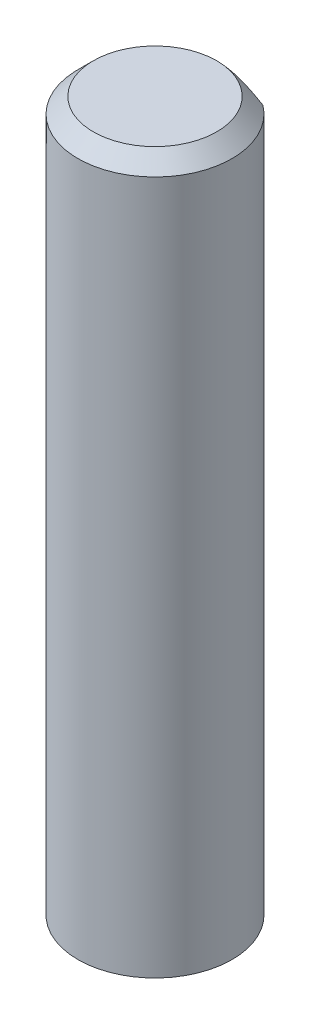
ISO-10303-21;
HEADER;
FILE_DESCRIPTION(('STEP AP214'),'2;1');
FILE_NAME('part.step','',(''),(''),'','','');
FILE_SCHEMA(('AUTOMOTIVE_DESIGN { 1 0 10303 214 1 1 1 1 }'));
ENDSEC;
DATA;
#1=APPLICATION_CONTEXT('core data for automotive mechanical design processes');
#2=APPLICATION_PROTOCOL_DEFINITION('international standard','automotive_design',2000,#1);
#3=PRODUCT_CONTEXT('',#1,'mechanical');
#4=PRODUCT('Part','Part','',(#3));
#5=PRODUCT_RELATED_PRODUCT_CATEGORY('part','',(#4));
#6=PRODUCT_DEFINITION_FORMATION('','',#4);
#7=PRODUCT_DEFINITION_CONTEXT('part definition',#1,'design');
#8=PRODUCT_DEFINITION('design','',#6,#7);
#9=PRODUCT_DEFINITION_SHAPE('','',#8);
#10=(LENGTH_UNIT() NAMED_UNIT(*) SI_UNIT(.MILLI.,.METRE.));
#11=(NAMED_UNIT(*) PLANE_ANGLE_UNIT() SI_UNIT($,.RADIAN.));
#12=(NAMED_UNIT(*) SI_UNIT($,.STERADIAN.) SOLID_ANGLE_UNIT());
#13=UNCERTAINTY_MEASURE_WITH_UNIT(LENGTH_MEASURE(1.E-05),#10,'distance_accuracy_value','');
#14=(GEOMETRIC_REPRESENTATION_CONTEXT(3) GLOBAL_UNCERTAINTY_ASSIGNED_CONTEXT((#13)) GLOBAL_UNIT_ASSIGNED_CONTEXT((#10,
#11,#12)) REPRESENTATION_CONTEXT('',''));
#15=CARTESIAN_POINT('',(0.,0.,0.));
#16=DIRECTION('',(0.,0.,1.));
#17=DIRECTION('',(1.,0.,0.));
#18=AXIS2_PLACEMENT_3D('',#15,#16,#17);
#19=CARTESIAN_POINT('',(0.,23.,0.));
#20=DIRECTION('',(0.,-1.,0.));
#21=DIRECTION('',(0.,0.,-1.));
#22=AXIS2_PLACEMENT_3D('',#19,#20,#21);
#23=CYLINDRICAL_SURFACE('',#22,2.5);
#24=CARTESIAN_POINT('',(0.,0.,0.));
#25=DIRECTION('',(0.,1.,0.));
#26=DIRECTION('',(0.,0.,1.));
#27=AXIS2_PLACEMENT_3D('',#24,#25,#26);
#28=CIRCLE('',#27,2.5);
#29=CARTESIAN_POINT('',(0.,0.,2.5));
#30=VERTEX_POINT('',#29);
#31=EDGE_CURVE('E86',#30,#30,#28,.T.);
#32=ORIENTED_EDGE('',*,*,#31,.T.);
#33=EDGE_LOOP('',(#32));
#34=FACE_BOUND('',#33,.T.);
#35=DIRECTION('',(0.,-1.,0.));
#36=VECTOR('',#35,1.);
#37=CARTESIAN_POINT('',(1.5,23.,-2.));
#38=LINE('',#37,#36);
#39=CARTESIAN_POINT('',(1.5,22.5,-2.));
#40=VERTEX_POINT('',#39);
#41=CARTESIAN_POINT('',(1.49999999999999,5.,-2.));
#42=VERTEX_POINT('',#41);
#43=EDGE_CURVE('E90',#40,#42,#38,.T.);
#44=ORIENTED_EDGE('',*,*,#43,.F.);
#45=CARTESIAN_POINT('',(0.,22.5,0.));
#46=DIRECTION('',(0.,1.,0.));
#47=DIRECTION('',(0.,0.,1.));
#48=AXIS2_PLACEMENT_3D('',#45,#46,#47);
#49=CIRCLE('',#48,2.5);
#50=CARTESIAN_POINT('',(-1.5,22.5,-2.));
#51=VERTEX_POINT('',#50);
#52=EDGE_CURVE('E81',#40,#51,#49,.F.);
#53=ORIENTED_EDGE('',*,*,#52,.T.);
#54=DIRECTION('',(0.,-1.,0.));
#55=VECTOR('',#54,1.);
#56=CARTESIAN_POINT('',(-1.5,23.,-2.));
#57=LINE('',#56,#55);
#58=CARTESIAN_POINT('',(-1.49999999999999,5.,-2.));
#59=VERTEX_POINT('',#58);
#60=EDGE_CURVE('E62',#59,#51,#57,.F.);
#61=ORIENTED_EDGE('',*,*,#60,.F.);
#62=CARTESIAN_POINT('',(0.,5.,0.));
#63=DIRECTION('',(0.,1.,0.));
#64=DIRECTION('',(0.,0.,1.));
#65=AXIS2_PLACEMENT_3D('',#62,#63,#64);
#66=CIRCLE('',#65,2.5);
#67=EDGE_CURVE('E12',#42,#59,#66,.T.);
#68=ORIENTED_EDGE('',*,*,#67,.F.);
#69=EDGE_LOOP('',(#44,#53,#61,#68));
#70=FACE_BOUND('',#69,.T.);
#71=ADVANCED_FACE('F45',(#34,#70),#23,.T.);
#72=CARTESIAN_POINT('',(0.,23.,0.));
#73=DIRECTION('',(0.,-1.,0.));
#74=DIRECTION('',(0.,0.,-1.));
#75=AXIS2_PLACEMENT_3D('',#72,#73,#74);
#76=CONICAL_SURFACE('',#75,1.99999999999999,0.785398163397452);
#77=ORIENTED_EDGE('',*,*,#52,.F.);
#78=CARTESIAN_POINT('',(7.25449509393499,17.4748621894396,-2.));
#79=CARTESIAN_POINT('',(7.10130735006501,17.6225333023172,-2.));
#80=CARTESIAN_POINT('',(6.94796117066203,17.7700405533027,-2.));
#81=CARTESIAN_POINT('',(6.64086781678304,18.0646400627591,-2.));
#82=CARTESIAN_POINT('',(6.48712063829408,18.211732317046,-2.));
#83=CARTESIAN_POINT('',(6.17908580623658,18.5054673118209,-2.));
#84=CARTESIAN_POINT('',(6.02479796972235,18.6521098605631,-2.));
#85=CARTESIAN_POINT('',(5.71562565052945,18.9447636471818,-2.));
#86=CARTESIAN_POINT('',(5.56074117050023,19.0907748878557,-2.));
#87=CARTESIAN_POINT('',(5.25286852088393,19.3795176670505,-2.));
#88=CARTESIAN_POINT('',(5.09989301195927,19.5222626949932,-2.));
#89=CARTESIAN_POINT('',(4.79302169158752,19.8067597803593,-2.));
#90=CARTESIAN_POINT('',(4.63912588464054,19.9485118426307,-2.));
#91=CARTESIAN_POINT('',(4.33016393943173,20.2306857487514,-2.));
#92=CARTESIAN_POINT('',(4.17509799539249,20.3711078049969,-2.));
#93=CARTESIAN_POINT('',(3.86338505676843,20.6501835027987,-2.));
#94=CARTESIAN_POINT('',(3.70673810325563,20.7888371900835,-2.));
#95=CARTESIAN_POINT('',(3.43709252348037,21.0237456599132,-2.));
#96=CARTESIAN_POINT('',(3.3246321098571,21.1206174520891,-2.));
#97=CARTESIAN_POINT('',(3.09830786962942,21.3127348108483,-2.));
#98=CARTESIAN_POINT('',(2.98444390619278,21.4079802166812,-2.));
#99=CARTESIAN_POINT('',(2.75379363964561,21.5972095932808,-2.));
#100=CARTESIAN_POINT('',(2.6369896345465,21.6911720611587,-2.));
#101=CARTESIAN_POINT('',(2.40099073907245,21.8760022572099,-2.));
#102=CARTESIAN_POINT('',(2.28179646718807,21.9668707699484,-2.));
#103=CARTESIAN_POINT('',(2.03847006982841,22.1454555557783,-2.));
#104=CARTESIAN_POINT('',(1.91429216532267,22.2331098475468,-2.));
#105=CARTESIAN_POINT('',(1.66118669776511,22.4018133650594,-2.));
#106=CARTESIAN_POINT('',(1.53225290587243,22.4828534473632,-2.));
#107=CARTESIAN_POINT('',(1.33495952912817,22.5959838475536,-2.));
#108=CARTESIAN_POINT('',(1.26893132591604,22.6321076401526,-2.));
#109=CARTESIAN_POINT('',(1.13516497109581,22.701021995293,-2.));
#110=CARTESIAN_POINT('',(1.06742649606793,22.7338119214026,-2.));
#111=CARTESIAN_POINT('',(0.861686658909709,22.8257190537923,-2.));
#112=CARTESIAN_POINT('',(0.720677816064533,22.8786648196837,-2.));
#113=CARTESIAN_POINT('',(0.509481676281375,22.9371187351225,-2.));
#114=CARTESIAN_POINT('',(0.442092975904698,22.952813264213,-2.));
#115=CARTESIAN_POINT('',(0.306116368603034,22.9778112037307,-2.));
#116=CARTESIAN_POINT('',(0.237528598088365,22.9871153363616,-2.));
#117=CARTESIAN_POINT('',(0.100031376223158,22.9986666035481,-2.));
#118=CARTESIAN_POINT('',(0.0311243530281637,23.000942169019,-2.));
#119=CARTESIAN_POINT('',(-0.106556947382143,22.9983466346817,-2.));
#120=CARTESIAN_POINT('',(-0.175331216465979,22.9934751101894,-2.));
#121=CARTESIAN_POINT('',(-0.311543049671943,22.9770030345677,-2.));
#122=CARTESIAN_POINT('',(-0.378986701737154,22.9654517625723,-2.));
#123=CARTESIAN_POINT('',(-0.512583330113459,22.9363904663663,-2.));
#124=CARTESIAN_POINT('',(-0.578735767199119,22.9188780067064,-2.));
#125=CARTESIAN_POINT('',(-0.70988486742688,22.8786771191567,-2.));
#126=CARTESIAN_POINT('',(-0.77487156611104,22.8559566346769,-2.));
#127=CARTESIAN_POINT('',(-0.903184817554153,22.8063166319853,-2.));
#128=CARTESIAN_POINT('',(-0.966511680534066,22.7793979050506,-2.));
#129=CARTESIAN_POINT('',(-1.14796812924228,22.6963924835464,-2.));
#130=CARTESIAN_POINT('',(-1.2640655721229,22.6358782904442,-2.));
#131=CARTESIAN_POINT('',(-1.49169480576319,22.5067340076282,-2.));
#132=CARTESIAN_POINT('',(-1.60322106603357,22.4380944561193,-2.));
#133=CARTESIAN_POINT('',(-1.8230977741736,22.2950601132636,-2.));
#134=CARTESIAN_POINT('',(-1.93143439836526,22.2206442546276,-2.));
#135=CARTESIAN_POINT('',(-2.14528302159216,22.0679964579829,-2.));
#136=CARTESIAN_POINT('',(-2.25079630697307,21.9897663052932,-2.));
#137=CARTESIAN_POINT('',(-2.46102164104655,21.8295195126461,-2.));
#138=CARTESIAN_POINT('',(-2.56570653947074,21.7474674246381,-2.));
#139=CARTESIAN_POINT('',(-2.77339523632031,21.5812502568903,-2.));
#140=CARTESIAN_POINT('',(-2.87639886902486,21.4970849709051,-2.));
#141=CARTESIAN_POINT('',(-3.08083617414382,21.3273558641171,-2.));
#142=CARTESIAN_POINT('',(-3.18227296233446,21.2417957867596,-2.));
#143=CARTESIAN_POINT('',(-3.38409046224511,21.0694378217029,-2.));
#144=CARTESIAN_POINT('',(-3.48447115422882,20.9826399109422,-2.));
#145=CARTESIAN_POINT('',(-3.74503494540094,20.7551045583745,-2.));
#146=CARTESIAN_POINT('',(-3.90454473001093,20.6135966537421,-2.));
#147=CARTESIAN_POINT('',(-4.22196750021647,20.3287987496806,-2.));
#148=CARTESIAN_POINT('',(-4.37988044340186,20.1855087031441,-2.));
#149=CARTESIAN_POINT('',(-4.69464488547224,19.8974851991826,-2.));
#150=CARTESIAN_POINT('',(-4.85149529846695,19.7527505563921,-2.));
#151=CARTESIAN_POINT('',(-5.16426835011335,19.4622820600581,-2.));
#152=CARTESIAN_POINT('',(-5.32019098415882,19.3165482015615,-2.));
#153=CARTESIAN_POINT('',(-5.77444722521687,18.8898726923299,-2.));
#154=CARTESIAN_POINT('',(-6.07181304429516,18.60790094027,-2.));
#155=CARTESIAN_POINT('',(-6.51639625170131,18.1837327048776,-2.));
#156=CARTESIAN_POINT('',(-6.6642668048596,18.0422184047954,-2.));
#157=CARTESIAN_POINT('',(-6.95963983782915,17.758808667262,-2.));
#158=CARTESIAN_POINT('',(-7.10714232078472,17.6169132330884,-2.));
#159=CARTESIAN_POINT('',(-7.25449509393499,17.4748621894396,-2.));
#160=B_SPLINE_CURVE_WITH_KNOTS('',3,(#78,#79,#80,#81,#82,#83,#84,#85,#86,#87,#88,#89,#90,#91,
#92,#93,#94,#95,#96,#97,#98,#99,#100,#101,#102,#103,#104,#105,#106,#107,#108,#109,#110,#111,
#112,#113,#114,#115,#116,#117,#118,#119,#120,#121,#122,#123,#124,#125,#126,#127,#128,#129,#130,
#131,#132,#133,#134,#135,#136,#137,#138,#139,#140,#141,#142,#143,#144,#145,#146,#147,#148,#149,
#150,#151,#152,#153,#154,#155,#156,#157,#158,#159),.UNSPECIFIED.,.F.,.F.,(4,2,2,2,2,2,2,2,2,2,2,
2,2,2,2,2,2,2,2,2,2,2,2,2,2,2,2,2,2,2,2,2,2,2,2,2,2,2,2,2,4),(0.,0.638325684632952,
1.27665778195366,1.91523209330675,2.55380357225128,3.18149355021984,3.80918046139174,
4.43676538374957,5.06433404423319,5.50961287695847,5.95493546880106,6.40462129047102,
6.85419221844636,7.31006027528207,7.7665482077655,7.99224774326355,8.21799028400565,
8.66779012544947,8.87511804988881,9.08242253953045,9.28888736629401,9.495364461808,
9.70033738269662,9.9053941461925,10.1117486878832,10.3180643831431,10.71027255593,
11.1029420240844,11.4971177883212,11.891110793329,12.2901025646626,12.6891334296007,
13.0872283325827,13.4853306619841,14.125005452412,14.7646971874361,15.4049659191381,
16.0452378269746,17.2746173396843,17.8886431338305,18.5026636644641),.UNSPECIFIED.);
#161=CARTESIAN_POINT('',(0.,23.,-2.));
#162=VERTEX_POINT('',#161);
#163=EDGE_CURVE('E55',#40,#162,#160,.T.);
#164=ORIENTED_EDGE('',*,*,#163,.T.);
#165=CARTESIAN_POINT('',(0.,23.,0.));
#166=DIRECTION('',(0.,1.,0.));
#167=DIRECTION('',(0.,0.,1.));
#168=AXIS2_PLACEMENT_3D('',#165,#166,#167);
#169=CIRCLE('',#168,1.99999999999999);
#170=EDGE_CURVE('E83',#162,#162,#169,.T.);
#171=ORIENTED_EDGE('',*,*,#170,.F.);
#172=EDGE_CURVE('E75',#162,#51,#160,.T.);
#173=ORIENTED_EDGE('',*,*,#172,.T.);
#174=EDGE_LOOP('',(#77,#164,#171,#173));
#175=FACE_BOUND('',#174,.T.);
#176=ADVANCED_FACE('F48',(#175),#76,.T.);
#177=CARTESIAN_POINT('',(0.,23.,0.));
#178=DIRECTION('',(0.,1.,0.));
#179=DIRECTION('',(0.,0.,1.));
#180=AXIS2_PLACEMENT_3D('',#177,#178,#179);
#181=PLANE('',#180);
#182=ORIENTED_EDGE('',*,*,#170,.T.);
#183=EDGE_LOOP('',(#182));
#184=FACE_BOUND('',#183,.T.);
#185=ADVANCED_FACE('F85',(#184),#181,.T.);
#186=CARTESIAN_POINT('',(0.,0.,0.));
#187=DIRECTION('',(0.,1.,0.));
#188=DIRECTION('',(0.,0.,1.));
#189=AXIS2_PLACEMENT_3D('',#186,#187,#188);
#190=PLANE('',#189);
#191=ORIENTED_EDGE('',*,*,#31,.F.);
#192=EDGE_LOOP('',(#191));
#193=FACE_BOUND('',#192,.T.);
#194=ADVANCED_FACE('F105',(#193),#190,.F.);
#195=CARTESIAN_POINT('',(2.5,5.,-2.));
#196=DIRECTION('',(0.,1.,0.));
#197=DIRECTION('',(0.,0.,1.));
#198=AXIS2_PLACEMENT_3D('',#195,#196,#197);
#199=PLANE('',#198);
#200=DIRECTION('',(-1.,0.,0.));
#201=VECTOR('',#200,1.);
#202=CARTESIAN_POINT('',(2.5,5.,-2.));
#203=LINE('',#202,#201);
#204=EDGE_CURVE('E116',#42,#59,#203,.T.);
#205=ORIENTED_EDGE('',*,*,#204,.F.);
#206=ORIENTED_EDGE('',*,*,#67,.T.);
#207=EDGE_LOOP('',(#205,#206));
#208=FACE_BOUND('',#207,.T.);
#209=ADVANCED_FACE('F102',(#208),#199,.T.);
#210=CARTESIAN_POINT('',(2.5,23.,-2.));
#211=DIRECTION('',(0.,0.,-1.));
#212=DIRECTION('',(0.,1.,0.));
#213=AXIS2_PLACEMENT_3D('',#210,#211,#212);
#214=PLANE('',#213);
#215=ORIENTED_EDGE('',*,*,#43,.T.);
#216=ORIENTED_EDGE('',*,*,#204,.T.);
#217=ORIENTED_EDGE('',*,*,#60,.T.);
#218=ORIENTED_EDGE('',*,*,#172,.F.);
#219=ORIENTED_EDGE('',*,*,#163,.F.);
#220=EDGE_LOOP('',(#215,#216,#217,#218,#219));
#221=FACE_BOUND('',#220,.T.);
#222=ADVANCED_FACE('F76',(#221),#214,.T.);
#223=CLOSED_SHELL('',(#71,#176,#185,#194,#209,#222));
#224=MANIFOLD_SOLID_BREP('B2',#223);
#225=ADVANCED_BREP_SHAPE_REPRESENTATION('',(#18,#224),#14);
#226=SHAPE_DEFINITION_REPRESENTATION(#9,#225);
ENDSEC;
END-ISO-10303-21;
